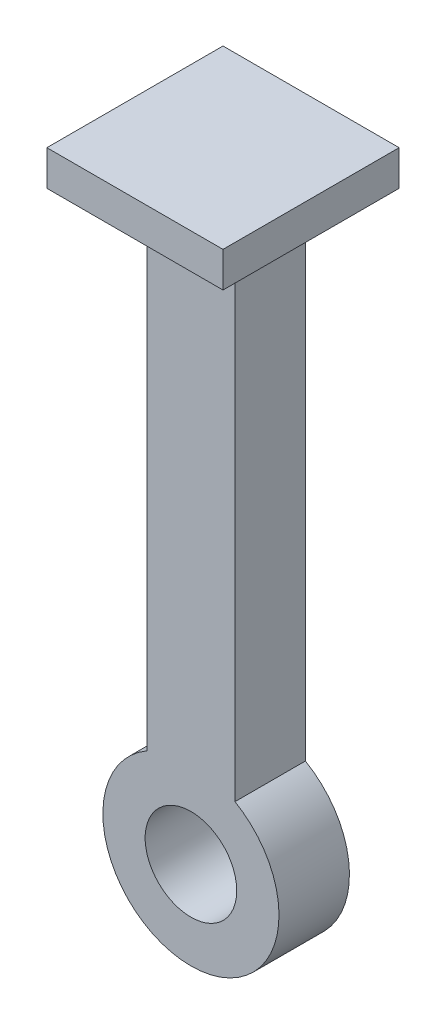
ISO-10303-21;
HEADER;
FILE_DESCRIPTION(('STEP AP214'),'2;1');
FILE_NAME('part.step','',(''),(''),'','','');
FILE_SCHEMA(('AUTOMOTIVE_DESIGN { 1 0 10303 214 1 1 1 1 }'));
ENDSEC;
DATA;
#1=APPLICATION_CONTEXT('core data for automotive mechanical design processes');
#2=APPLICATION_PROTOCOL_DEFINITION('international standard','automotive_design',2000,#1);
#3=PRODUCT_CONTEXT('',#1,'mechanical');
#4=PRODUCT('Part','Part','',(#3));
#5=PRODUCT_RELATED_PRODUCT_CATEGORY('part','',(#4));
#6=PRODUCT_DEFINITION_FORMATION('','',#4);
#7=PRODUCT_DEFINITION_CONTEXT('part definition',#1,'design');
#8=PRODUCT_DEFINITION('design','',#6,#7);
#9=PRODUCT_DEFINITION_SHAPE('','',#8);
#10=(LENGTH_UNIT() NAMED_UNIT(*) SI_UNIT(.MILLI.,.METRE.));
#11=(NAMED_UNIT(*) PLANE_ANGLE_UNIT() SI_UNIT($,.RADIAN.));
#12=(NAMED_UNIT(*) SI_UNIT($,.STERADIAN.) SOLID_ANGLE_UNIT());
#13=UNCERTAINTY_MEASURE_WITH_UNIT(LENGTH_MEASURE(1.E-05),#10,'distance_accuracy_value','');
#14=(GEOMETRIC_REPRESENTATION_CONTEXT(3) GLOBAL_UNCERTAINTY_ASSIGNED_CONTEXT((#13)) GLOBAL_UNIT_ASSIGNED_CONTEXT((#10,
#11,#12)) REPRESENTATION_CONTEXT('',''));
#15=CARTESIAN_POINT('',(0.,0.,0.));
#16=DIRECTION('',(0.,0.,1.));
#17=DIRECTION('',(1.,0.,0.));
#18=AXIS2_PLACEMENT_3D('',#15,#16,#17);
#19=CARTESIAN_POINT('',(0.,0.,5.08));
#20=DIRECTION('',(0.,0.,-1.));
#21=DIRECTION('',(-1.,0.,0.));
#22=AXIS2_PLACEMENT_3D('',#19,#20,#21);
#23=CYLINDRICAL_SURFACE('',#22,6.35);
#24=CARTESIAN_POINT('',(0.,0.,0.));
#25=DIRECTION('',(0.,0.,1.));
#26=DIRECTION('',(1.,0.,0.));
#27=AXIS2_PLACEMENT_3D('',#24,#25,#26);
#28=CIRCLE('',#27,6.35);
#29=CARTESIAN_POINT('',(-3.175,5.49926131403118,0.));
#30=VERTEX_POINT('',#29);
#31=CARTESIAN_POINT('',(3.175,5.49926131403118,0.));
#32=VERTEX_POINT('',#31);
#33=EDGE_CURVE('E153',#30,#32,#28,.T.);
#34=ORIENTED_EDGE('',*,*,#33,.T.);
#35=DIRECTION('',(0.,0.,-1.));
#36=VECTOR('',#35,1.);
#37=CARTESIAN_POINT('',(3.175,5.49926131403118,5.08));
#38=LINE('',#37,#36);
#39=CARTESIAN_POINT('',(3.175,5.49926131403118,5.08));
#40=VERTEX_POINT('',#39);
#41=EDGE_CURVE('E11',#40,#32,#38,.T.);
#42=ORIENTED_EDGE('',*,*,#41,.F.);
#43=CARTESIAN_POINT('',(0.,0.,5.08));
#44=DIRECTION('',(0.,0.,1.));
#45=DIRECTION('',(1.,0.,0.));
#46=AXIS2_PLACEMENT_3D('',#43,#44,#45);
#47=CIRCLE('',#46,6.35);
#48=CARTESIAN_POINT('',(-3.175,5.49926131403118,5.08));
#49=VERTEX_POINT('',#48);
#50=EDGE_CURVE('E163',#49,#40,#47,.T.);
#51=ORIENTED_EDGE('',*,*,#50,.F.);
#52=DIRECTION('',(0.,0.,-1.));
#53=VECTOR('',#52,1.);
#54=CARTESIAN_POINT('',(-3.175,5.49926131403118,5.08));
#55=LINE('',#54,#53);
#56=EDGE_CURVE('E65',#49,#30,#55,.T.);
#57=ORIENTED_EDGE('',*,*,#56,.T.);
#58=EDGE_LOOP('',(#34,#42,#51,#57));
#59=FACE_BOUND('',#58,.T.);
#60=ADVANCED_FACE('F47',(#59),#23,.T.);
#61=CARTESIAN_POINT('',(3.175,0.,5.08));
#62=DIRECTION('',(-1.,0.,0.));
#63=DIRECTION('',(0.,0.,1.));
#64=AXIS2_PLACEMENT_3D('',#61,#62,#63);
#65=PLANE('',#64);
#66=DIRECTION('',(0.,1.,0.));
#67=VECTOR('',#66,1.);
#68=CARTESIAN_POINT('',(3.175,0.,0.));
#69=LINE('',#68,#67);
#70=CARTESIAN_POINT('',(3.175,41.0592613140312,0.));
#71=VERTEX_POINT('',#70);
#72=EDGE_CURVE('E178',#32,#71,#69,.T.);
#73=ORIENTED_EDGE('',*,*,#72,.T.);
#74=DIRECTION('',(0.,0.,-1.));
#75=VECTOR('',#74,1.);
#76=CARTESIAN_POINT('',(3.175,41.0592613140312,5.08));
#77=LINE('',#76,#75);
#78=CARTESIAN_POINT('',(3.175,41.0592613140312,5.08));
#79=VERTEX_POINT('',#78);
#80=EDGE_CURVE('E57',#79,#71,#77,.T.);
#81=ORIENTED_EDGE('',*,*,#80,.F.);
#82=DIRECTION('',(0.,1.,0.));
#83=VECTOR('',#82,1.);
#84=CARTESIAN_POINT('',(3.175,0.,5.08));
#85=LINE('',#84,#83);
#86=EDGE_CURVE('E89',#40,#79,#85,.T.);
#87=ORIENTED_EDGE('',*,*,#86,.F.);
#88=ORIENTED_EDGE('',*,*,#41,.T.);
#89=EDGE_LOOP('',(#73,#81,#87,#88));
#90=FACE_BOUND('',#89,.T.);
#91=ADVANCED_FACE('F196',(#90),#65,.F.);
#92=CARTESIAN_POINT('',(0.,0.,5.08));
#93=DIRECTION('',(0.,0.,-1.));
#94=DIRECTION('',(-1.,0.,0.));
#95=AXIS2_PLACEMENT_3D('',#92,#93,#94);
#96=CYLINDRICAL_SURFACE('',#95,3.302);
#97=CARTESIAN_POINT('',(0.,0.,5.08));
#98=DIRECTION('',(0.,0.,1.));
#99=DIRECTION('',(1.,0.,0.));
#100=AXIS2_PLACEMENT_3D('',#97,#98,#99);
#101=CIRCLE('',#100,3.302);
#102=CARTESIAN_POINT('',(3.302,0.,5.08));
#103=VERTEX_POINT('',#102);
#104=EDGE_CURVE('E159',#103,#103,#101,.T.);
#105=ORIENTED_EDGE('',*,*,#104,.T.);
#106=EDGE_LOOP('',(#105));
#107=FACE_BOUND('',#106,.T.);
#108=CARTESIAN_POINT('',(0.,0.,0.));
#109=DIRECTION('',(0.,0.,1.));
#110=DIRECTION('',(1.,0.,0.));
#111=AXIS2_PLACEMENT_3D('',#108,#109,#110);
#112=CIRCLE('',#111,3.302);
#113=CARTESIAN_POINT('',(3.302,0.,0.));
#114=VERTEX_POINT('',#113);
#115=EDGE_CURVE('E148',#114,#114,#112,.T.);
#116=ORIENTED_EDGE('',*,*,#115,.F.);
#117=EDGE_LOOP('',(#116));
#118=FACE_BOUND('',#117,.T.);
#119=ADVANCED_FACE('F49',(#107,#118),#96,.F.);
#120=CARTESIAN_POINT('',(-3.175,0.,5.08));
#121=DIRECTION('',(-1.,0.,0.));
#122=DIRECTION('',(0.,0.,1.));
#123=AXIS2_PLACEMENT_3D('',#120,#121,#122);
#124=PLANE('',#123);
#125=DIRECTION('',(0.,1.,0.));
#126=VECTOR('',#125,1.);
#127=CARTESIAN_POINT('',(-3.175,0.,0.));
#128=LINE('',#127,#126);
#129=CARTESIAN_POINT('',(-3.175,41.0592613140312,0.));
#130=VERTEX_POINT('',#129);
#131=EDGE_CURVE('E164',#30,#130,#128,.T.);
#132=ORIENTED_EDGE('',*,*,#131,.F.);
#133=ORIENTED_EDGE('',*,*,#56,.F.);
#134=DIRECTION('',(0.,1.,0.));
#135=VECTOR('',#134,1.);
#136=CARTESIAN_POINT('',(-3.175,0.,5.08));
#137=LINE('',#136,#135);
#138=CARTESIAN_POINT('',(-3.175,41.0592613140312,5.08));
#139=VERTEX_POINT('',#138);
#140=EDGE_CURVE('E173',#49,#139,#137,.T.);
#141=ORIENTED_EDGE('',*,*,#140,.T.);
#142=DIRECTION('',(0.,0.,-1.));
#143=VECTOR('',#142,1.);
#144=CARTESIAN_POINT('',(-3.175,41.0592613140312,5.08));
#145=LINE('',#144,#143);
#146=EDGE_CURVE('E78',#139,#130,#145,.T.);
#147=ORIENTED_EDGE('',*,*,#146,.T.);
#148=EDGE_LOOP('',(#132,#133,#141,#147));
#149=FACE_BOUND('',#148,.T.);
#150=ADVANCED_FACE('F200',(#149),#124,.T.);
#151=CARTESIAN_POINT('',(0.,0.,5.08));
#152=DIRECTION('',(0.,0.,1.));
#153=DIRECTION('',(1.,0.,0.));
#154=AXIS2_PLACEMENT_3D('',#151,#152,#153);
#155=PLANE('',#154);
#156=ORIENTED_EDGE('',*,*,#104,.F.);
#157=EDGE_LOOP('',(#156));
#158=FACE_BOUND('',#157,.T.);
#159=ORIENTED_EDGE('',*,*,#50,.T.);
#160=ORIENTED_EDGE('',*,*,#86,.T.);
#161=DIRECTION('',(1.,0.,0.));
#162=VECTOR('',#161,1.);
#163=CARTESIAN_POINT('',(0.,41.0592613140312,5.08));
#164=LINE('',#163,#162);
#165=EDGE_CURVE('E169',#139,#79,#164,.T.);
#166=ORIENTED_EDGE('',*,*,#165,.F.);
#167=ORIENTED_EDGE('',*,*,#140,.F.);
#168=EDGE_LOOP('',(#159,#160,#166,#167));
#169=FACE_BOUND('',#168,.T.);
#170=ADVANCED_FACE('F202',(#158,#169),#155,.T.);
#171=CARTESIAN_POINT('',(0.,0.,0.));
#172=DIRECTION('',(0.,0.,1.));
#173=DIRECTION('',(1.,0.,0.));
#174=AXIS2_PLACEMENT_3D('',#171,#172,#173);
#175=PLANE('',#174);
#176=ORIENTED_EDGE('',*,*,#115,.T.);
#177=EDGE_LOOP('',(#176));
#178=FACE_BOUND('',#177,.T.);
#179=ORIENTED_EDGE('',*,*,#33,.F.);
#180=ORIENTED_EDGE('',*,*,#131,.T.);
#181=DIRECTION('',(1.,0.,0.));
#182=VECTOR('',#181,1.);
#183=CARTESIAN_POINT('',(0.,41.0592613140312,0.));
#184=LINE('',#183,#182);
#185=EDGE_CURVE('E182',#130,#71,#184,.T.);
#186=ORIENTED_EDGE('',*,*,#185,.T.);
#187=ORIENTED_EDGE('',*,*,#72,.F.);
#188=EDGE_LOOP('',(#179,#180,#186,#187));
#189=FACE_BOUND('',#188,.T.);
#190=ADVANCED_FACE('F199',(#178,#189),#175,.F.);
#191=CARTESIAN_POINT('',(6.35,43.5992613140312,-3.58219613567286));
#192=DIRECTION('',(-1.,0.,0.));
#193=DIRECTION('',(0.,0.,1.));
#194=AXIS2_PLACEMENT_3D('',#191,#192,#193);
#195=PLANE('',#194);
#196=DIRECTION('',(0.,0.,-1.));
#197=VECTOR('',#196,1.);
#198=CARTESIAN_POINT('',(6.35,41.0592613140312,-3.58219613567286));
#199=LINE('',#198,#197);
#200=CARTESIAN_POINT('',(6.35,41.0592613140312,9.11780386432715));
#201=VERTEX_POINT('',#200);
#202=CARTESIAN_POINT('',(6.35,41.0592613140312,-3.58219613567286));
#203=VERTEX_POINT('',#202);
#204=EDGE_CURVE('E146',#201,#203,#199,.T.);
#205=ORIENTED_EDGE('',*,*,#204,.T.);
#206=DIRECTION('',(0.,-1.,0.));
#207=VECTOR('',#206,1.);
#208=CARTESIAN_POINT('',(6.35,43.5992613140312,-3.58219613567286));
#209=LINE('',#208,#207);
#210=CARTESIAN_POINT('',(6.35,43.5992613140312,-3.58219613567286));
#211=VERTEX_POINT('',#210);
#212=EDGE_CURVE('E124',#211,#203,#209,.T.);
#213=ORIENTED_EDGE('',*,*,#212,.F.);
#214=DIRECTION('',(0.,0.,-1.));
#215=VECTOR('',#214,1.);
#216=CARTESIAN_POINT('',(6.35,43.5992613140312,-3.58219613567286));
#217=LINE('',#216,#215);
#218=CARTESIAN_POINT('',(6.35,43.5992613140312,9.11780386432715));
#219=VERTEX_POINT('',#218);
#220=EDGE_CURVE('E132',#219,#211,#217,.T.);
#221=ORIENTED_EDGE('',*,*,#220,.F.);
#222=DIRECTION('',(0.,-1.,0.));
#223=VECTOR('',#222,1.);
#224=CARTESIAN_POINT('',(6.35,43.5992613140312,9.11780386432715));
#225=LINE('',#224,#223);
#226=EDGE_CURVE('E308',#219,#201,#225,.T.);
#227=ORIENTED_EDGE('',*,*,#226,.T.);
#228=EDGE_LOOP('',(#205,#213,#221,#227));
#229=FACE_BOUND('',#228,.T.);
#230=ADVANCED_FACE('F144',(#229),#195,.F.);
#231=CARTESIAN_POINT('',(-6.35,43.5992613140312,-3.58219613567286));
#232=DIRECTION('',(0.,0.,1.));
#233=DIRECTION('',(1.,0.,0.));
#234=AXIS2_PLACEMENT_3D('',#231,#232,#233);
#235=PLANE('',#234);
#236=DIRECTION('',(-1.,0.,0.));
#237=VECTOR('',#236,1.);
#238=CARTESIAN_POINT('',(-6.35,41.0592613140312,-3.58219613567286));
#239=LINE('',#238,#237);
#240=CARTESIAN_POINT('',(-6.35,41.0592613140312,-3.58219613567286));
#241=VERTEX_POINT('',#240);
#242=EDGE_CURVE('E316',#203,#241,#239,.T.);
#243=ORIENTED_EDGE('',*,*,#242,.T.);
#244=DIRECTION('',(0.,-1.,0.));
#245=VECTOR('',#244,1.);
#246=CARTESIAN_POINT('',(-6.35,43.5992613140312,-3.58219613567286));
#247=LINE('',#246,#245);
#248=CARTESIAN_POINT('',(-6.35,43.5992613140312,-3.58219613567286));
#249=VERTEX_POINT('',#248);
#250=EDGE_CURVE('E127',#249,#241,#247,.T.);
#251=ORIENTED_EDGE('',*,*,#250,.F.);
#252=DIRECTION('',(-1.,0.,0.));
#253=VECTOR('',#252,1.);
#254=CARTESIAN_POINT('',(-6.35,43.5992613140312,-3.58219613567286));
#255=LINE('',#254,#253);
#256=EDGE_CURVE('E120',#211,#249,#255,.T.);
#257=ORIENTED_EDGE('',*,*,#256,.F.);
#258=ORIENTED_EDGE('',*,*,#212,.T.);
#259=EDGE_LOOP('',(#243,#251,#257,#258));
#260=FACE_BOUND('',#259,.T.);
#261=ADVANCED_FACE('F122',(#260),#235,.F.);
#262=CARTESIAN_POINT('',(-6.35,43.5992613140312,-3.58219613567286));
#263=DIRECTION('',(1.,0.,0.));
#264=DIRECTION('',(0.,0.,-1.));
#265=AXIS2_PLACEMENT_3D('',#262,#263,#264);
#266=PLANE('',#265);
#267=DIRECTION('',(0.,0.,1.));
#268=VECTOR('',#267,1.);
#269=CARTESIAN_POINT('',(-6.35,41.0592613140312,-3.58219613567286));
#270=LINE('',#269,#268);
#271=CARTESIAN_POINT('',(-6.35,41.0592613140312,9.11780386432715));
#272=VERTEX_POINT('',#271);
#273=EDGE_CURVE('E312',#241,#272,#270,.T.);
#274=ORIENTED_EDGE('',*,*,#273,.T.);
#275=DIRECTION('',(0.,-1.,0.));
#276=VECTOR('',#275,1.);
#277=CARTESIAN_POINT('',(-6.35,43.5992613140312,9.11780386432715));
#278=LINE('',#277,#276);
#279=CARTESIAN_POINT('',(-6.35,43.5992613140312,9.11780386432715));
#280=VERTEX_POINT('',#279);
#281=EDGE_CURVE('E155',#280,#272,#278,.T.);
#282=ORIENTED_EDGE('',*,*,#281,.F.);
#283=DIRECTION('',(0.,0.,1.));
#284=VECTOR('',#283,1.);
#285=CARTESIAN_POINT('',(-6.35,43.5992613140312,-3.58219613567286));
#286=LINE('',#285,#284);
#287=EDGE_CURVE('E131',#249,#280,#286,.T.);
#288=ORIENTED_EDGE('',*,*,#287,.F.);
#289=ORIENTED_EDGE('',*,*,#250,.T.);
#290=EDGE_LOOP('',(#274,#282,#288,#289));
#291=FACE_BOUND('',#290,.T.);
#292=ADVANCED_FACE('F268',(#291),#266,.F.);
#293=CARTESIAN_POINT('',(-6.35,43.5992613140312,9.11780386432715));
#294=DIRECTION('',(0.,0.,-1.));
#295=DIRECTION('',(-1.,0.,0.));
#296=AXIS2_PLACEMENT_3D('',#293,#294,#295);
#297=PLANE('',#296);
#298=DIRECTION('',(1.,0.,0.));
#299=VECTOR('',#298,1.);
#300=CARTESIAN_POINT('',(-6.35,41.0592613140312,9.11780386432715));
#301=LINE('',#300,#299);
#302=EDGE_CURVE('E142',#272,#201,#301,.T.);
#303=ORIENTED_EDGE('',*,*,#302,.T.);
#304=ORIENTED_EDGE('',*,*,#226,.F.);
#305=DIRECTION('',(1.,0.,0.));
#306=VECTOR('',#305,1.);
#307=CARTESIAN_POINT('',(-6.35,43.5992613140312,9.11780386432715));
#308=LINE('',#307,#306);
#309=EDGE_CURVE('E137',#280,#219,#308,.T.);
#310=ORIENTED_EDGE('',*,*,#309,.F.);
#311=ORIENTED_EDGE('',*,*,#281,.T.);
#312=EDGE_LOOP('',(#303,#304,#310,#311));
#313=FACE_BOUND('',#312,.T.);
#314=ADVANCED_FACE('F277',(#313),#297,.F.);
#315=CARTESIAN_POINT('',(0.,43.5992613140312,0.));
#316=DIRECTION('',(0.,1.,0.));
#317=DIRECTION('',(0.,0.,1.));
#318=AXIS2_PLACEMENT_3D('',#315,#316,#317);
#319=PLANE('',#318);
#320=ORIENTED_EDGE('',*,*,#220,.T.);
#321=ORIENTED_EDGE('',*,*,#256,.T.);
#322=ORIENTED_EDGE('',*,*,#287,.T.);
#323=ORIENTED_EDGE('',*,*,#309,.T.);
#324=EDGE_LOOP('',(#320,#321,#322,#323));
#325=FACE_BOUND('',#324,.T.);
#326=ADVANCED_FACE('F135',(#325),#319,.T.);
#327=CARTESIAN_POINT('',(0.,41.0592613140312,0.));
#328=DIRECTION('',(0.,1.,0.));
#329=DIRECTION('',(0.,0.,1.));
#330=AXIS2_PLACEMENT_3D('',#327,#328,#329);
#331=PLANE('',#330);
#332=ORIENTED_EDGE('',*,*,#185,.F.);
#333=ORIENTED_EDGE('',*,*,#146,.F.);
#334=ORIENTED_EDGE('',*,*,#165,.T.);
#335=ORIENTED_EDGE('',*,*,#80,.T.);
#336=EDGE_LOOP('',(#332,#333,#334,#335));
#337=FACE_BOUND('',#336,.T.);
#338=ORIENTED_EDGE('',*,*,#204,.F.);
#339=ORIENTED_EDGE('',*,*,#302,.F.);
#340=ORIENTED_EDGE('',*,*,#273,.F.);
#341=ORIENTED_EDGE('',*,*,#242,.F.);
#342=EDGE_LOOP('',(#338,#339,#340,#341));
#343=FACE_BOUND('',#342,.T.);
#344=ADVANCED_FACE('F194',(#337,#343),#331,.F.);
#345=CLOSED_SHELL('',(#60,#91,#119,#150,#170,#190,#230,#261,#292,#314,#326,#344));
#346=MANIFOLD_SOLID_BREP('B2',#345);
#347=ADVANCED_BREP_SHAPE_REPRESENTATION('',(#18,#346),#14);
#348=SHAPE_DEFINITION_REPRESENTATION(#9,#347);
ENDSEC;
END-ISO-10303-21;
